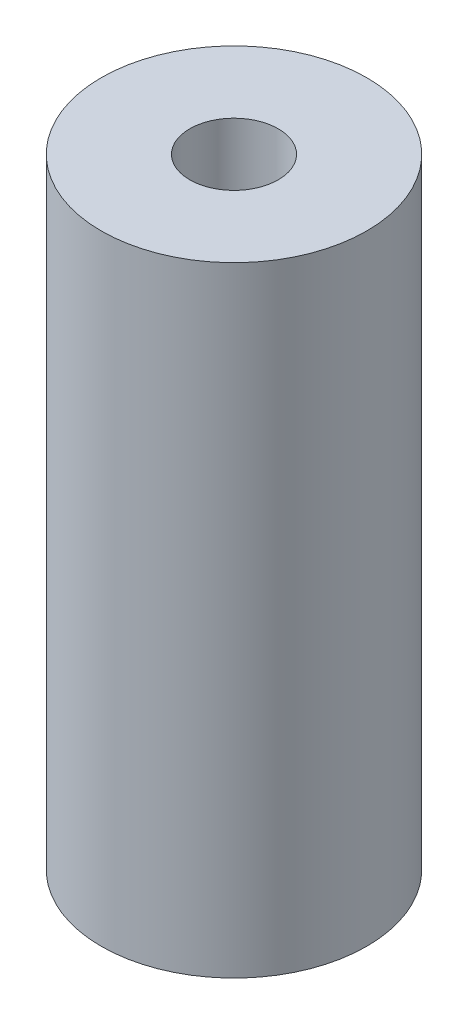
ISO-10303-21;
HEADER;
FILE_DESCRIPTION(('STEP AP214'),'2;1');
FILE_NAME('part.step','',(''),(''),'','','');
FILE_SCHEMA(('AUTOMOTIVE_DESIGN { 1 0 10303 214 1 1 1 1 }'));
ENDSEC;
DATA;
#1=APPLICATION_CONTEXT('core data for automotive mechanical design processes');
#2=APPLICATION_PROTOCOL_DEFINITION('international standard','automotive_design',2000,#1);
#3=PRODUCT_CONTEXT('',#1,'mechanical');
#4=PRODUCT('Part','Part','',(#3));
#5=PRODUCT_RELATED_PRODUCT_CATEGORY('part','',(#4));
#6=PRODUCT_DEFINITION_FORMATION('','',#4);
#7=PRODUCT_DEFINITION_CONTEXT('part definition',#1,'design');
#8=PRODUCT_DEFINITION('design','',#6,#7);
#9=PRODUCT_DEFINITION_SHAPE('','',#8);
#10=(LENGTH_UNIT() NAMED_UNIT(*) SI_UNIT(.MILLI.,.METRE.));
#11=(NAMED_UNIT(*) PLANE_ANGLE_UNIT() SI_UNIT($,.RADIAN.));
#12=(NAMED_UNIT(*) SI_UNIT($,.STERADIAN.) SOLID_ANGLE_UNIT());
#13=UNCERTAINTY_MEASURE_WITH_UNIT(LENGTH_MEASURE(1.E-05),#10,'distance_accuracy_value','');
#14=(GEOMETRIC_REPRESENTATION_CONTEXT(3) GLOBAL_UNCERTAINTY_ASSIGNED_CONTEXT((#13)) GLOBAL_UNIT_ASSIGNED_CONTEXT((#10,
#11,#12)) REPRESENTATION_CONTEXT('',''));
#15=CARTESIAN_POINT('',(0.,0.,0.));
#16=DIRECTION('',(0.,0.,1.));
#17=DIRECTION('',(1.,0.,0.));
#18=AXIS2_PLACEMENT_3D('',#15,#16,#17);
#19=CARTESIAN_POINT('',(0.,14.,0.));
#20=DIRECTION('',(0.,1.,0.));
#21=DIRECTION('',(0.,0.,1.));
#22=AXIS2_PLACEMENT_3D('',#19,#20,#21);
#23=PLANE('',#22);
#24=CARTESIAN_POINT('',(0.,14.,0.));
#25=DIRECTION('',(0.,1.,0.));
#26=DIRECTION('',(0.,0.,1.));
#27=AXIS2_PLACEMENT_3D('',#24,#25,#26);
#28=CIRCLE('',#27,3.);
#29=CARTESIAN_POINT('',(0.,14.,3.));
#30=VERTEX_POINT('',#29);
#31=EDGE_CURVE('E10',#30,#30,#28,.T.);
#32=ORIENTED_EDGE('',*,*,#31,.T.);
#33=EDGE_LOOP('',(#32));
#34=FACE_BOUND('',#33,.T.);
#35=CARTESIAN_POINT('',(0.,14.,0.));
#36=DIRECTION('',(0.,1.,0.));
#37=DIRECTION('',(0.,0.,1.));
#38=AXIS2_PLACEMENT_3D('',#35,#36,#37);
#39=CIRCLE('',#38,1.);
#40=CARTESIAN_POINT('',(0.,14.,1.));
#41=VERTEX_POINT('',#40);
#42=EDGE_CURVE('E41',#41,#41,#39,.T.);
#43=ORIENTED_EDGE('',*,*,#42,.F.);
#44=EDGE_LOOP('',(#43));
#45=FACE_BOUND('',#44,.T.);
#46=ADVANCED_FACE('F30',(#34,#45),#23,.T.);
#47=CARTESIAN_POINT('',(0.,0.,0.));
#48=DIRECTION('',(0.,1.,0.));
#49=DIRECTION('',(0.,0.,1.));
#50=AXIS2_PLACEMENT_3D('',#47,#48,#49);
#51=PLANE('',#50);
#52=CARTESIAN_POINT('',(0.,0.,0.));
#53=DIRECTION('',(0.,1.,0.));
#54=DIRECTION('',(0.,0.,1.));
#55=AXIS2_PLACEMENT_3D('',#52,#53,#54);
#56=CIRCLE('',#55,3.);
#57=CARTESIAN_POINT('',(0.,0.,3.));
#58=VERTEX_POINT('',#57);
#59=EDGE_CURVE('E34',#58,#58,#56,.T.);
#60=ORIENTED_EDGE('',*,*,#59,.F.);
#61=EDGE_LOOP('',(#60));
#62=FACE_BOUND('',#61,.T.);
#63=CARTESIAN_POINT('',(0.,0.,0.));
#64=DIRECTION('',(0.,1.,0.));
#65=DIRECTION('',(0.,0.,1.));
#66=AXIS2_PLACEMENT_3D('',#63,#64,#65);
#67=CIRCLE('',#66,1.);
#68=CARTESIAN_POINT('',(0.,0.,1.));
#69=VERTEX_POINT('',#68);
#70=EDGE_CURVE('E43',#69,#69,#67,.T.);
#71=ORIENTED_EDGE('',*,*,#70,.T.);
#72=EDGE_LOOP('',(#71));
#73=FACE_BOUND('',#72,.T.);
#74=ADVANCED_FACE('F53',(#62,#73),#51,.F.);
#75=CARTESIAN_POINT('',(0.,14.,0.));
#76=DIRECTION('',(0.,-1.,0.));
#77=DIRECTION('',(0.,0.,-1.));
#78=AXIS2_PLACEMENT_3D('',#75,#76,#77);
#79=CYLINDRICAL_SURFACE('',#78,3.);
#80=ORIENTED_EDGE('',*,*,#31,.F.);
#81=EDGE_LOOP('',(#80));
#82=FACE_BOUND('',#81,.T.);
#83=ORIENTED_EDGE('',*,*,#59,.T.);
#84=EDGE_LOOP('',(#83));
#85=FACE_BOUND('',#84,.T.);
#86=ADVANCED_FACE('F32',(#82,#85),#79,.T.);
#87=CARTESIAN_POINT('',(0.,14.,0.));
#88=DIRECTION('',(0.,-1.,0.));
#89=DIRECTION('',(0.,0.,-1.));
#90=AXIS2_PLACEMENT_3D('',#87,#88,#89);
#91=CYLINDRICAL_SURFACE('',#90,1.);
#92=ORIENTED_EDGE('',*,*,#42,.T.);
#93=EDGE_LOOP('',(#92));
#94=FACE_BOUND('',#93,.T.);
#95=ORIENTED_EDGE('',*,*,#70,.F.);
#96=EDGE_LOOP('',(#95));
#97=FACE_BOUND('',#96,.T.);
#98=ADVANCED_FACE('F49',(#94,#97),#91,.F.);
#99=CLOSED_SHELL('',(#46,#74,#86,#98));
#100=MANIFOLD_SOLID_BREP('B2',#99);
#101=ADVANCED_BREP_SHAPE_REPRESENTATION('',(#18,#100),#14);
#102=SHAPE_DEFINITION_REPRESENTATION(#9,#101);
ENDSEC;
END-ISO-10303-21;
